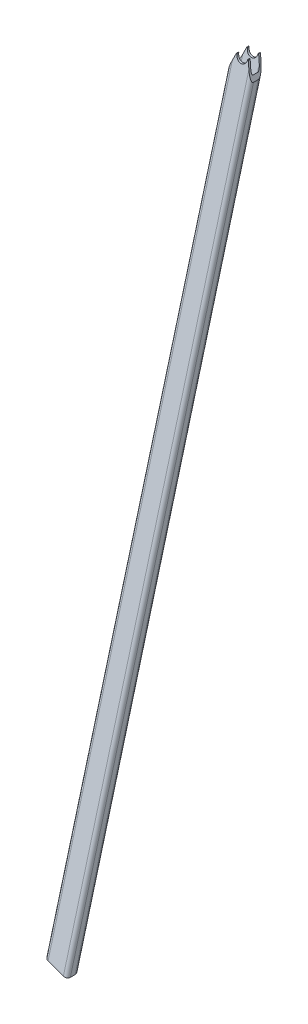
ISO-10303-21;
HEADER;
FILE_DESCRIPTION(('STEP AP214'),'2;1');
FILE_NAME('part.step','',(''),(''),'','','');
FILE_SCHEMA(('AUTOMOTIVE_DESIGN { 1 0 10303 214 1 1 1 1 }'));
ENDSEC;
DATA;
#1=APPLICATION_CONTEXT('core data for automotive mechanical design processes');
#2=APPLICATION_PROTOCOL_DEFINITION('international standard','automotive_design',2000,#1);
#3=PRODUCT_CONTEXT('',#1,'mechanical');
#4=PRODUCT('Part','Part','',(#3));
#5=PRODUCT_RELATED_PRODUCT_CATEGORY('part','',(#4));
#6=PRODUCT_DEFINITION_FORMATION('','',#4);
#7=PRODUCT_DEFINITION_CONTEXT('part definition',#1,'design');
#8=PRODUCT_DEFINITION('design','',#6,#7);
#9=PRODUCT_DEFINITION_SHAPE('','',#8);
#10=(LENGTH_UNIT() NAMED_UNIT(*) SI_UNIT(.MILLI.,.METRE.));
#11=(NAMED_UNIT(*) PLANE_ANGLE_UNIT() SI_UNIT($,.RADIAN.));
#12=(NAMED_UNIT(*) SI_UNIT($,.STERADIAN.) SOLID_ANGLE_UNIT());
#13=UNCERTAINTY_MEASURE_WITH_UNIT(LENGTH_MEASURE(1.E-05),#10,'distance_accuracy_value','');
#14=(GEOMETRIC_REPRESENTATION_CONTEXT(3) GLOBAL_UNCERTAINTY_ASSIGNED_CONTEXT((#13)) GLOBAL_UNIT_ASSIGNED_CONTEXT((#10,
#11,#12)) REPRESENTATION_CONTEXT('',''));
#15=CARTESIAN_POINT('',(0.,0.,0.));
#16=DIRECTION('',(0.,0.,1.));
#17=DIRECTION('',(1.,0.,0.));
#18=AXIS2_PLACEMENT_3D('',#15,#16,#17);
#19=CARTESIAN_POINT('',(0.,0.,0.));
#20=DIRECTION('',(0.,1.,0.));
#21=DIRECTION('',(0.,0.,1.));
#22=AXIS2_PLACEMENT_3D('',#19,#20,#21);
#23=PLANE('',#22);
#24=DIRECTION('',(1.,0.,0.));
#25=VECTOR('',#24,1.);
#26=CARTESIAN_POINT('',(0.,0.,10.3527618041008));
#27=LINE('',#26,#25);
#28=CARTESIAN_POINT('',(9.,0.,10.3527618041008));
#29=VERTEX_POINT('',#28);
#30=CARTESIAN_POINT('',(9.9999999999998,0.,10.3527618041008));
#31=VERTEX_POINT('',#30);
#32=EDGE_CURVE('E252',#29,#31,#27,.T.);
#33=ORIENTED_EDGE('',*,*,#32,.T.);
#34=DIRECTION('',(0.,0.,-1.));
#35=VECTOR('',#34,1.);
#36=CARTESIAN_POINT('',(9.99999999999981,0.,0.));
#37=LINE('',#36,#35);
#38=CARTESIAN_POINT('',(9.9999999999998,0.,7.24693326287058));
#39=VERTEX_POINT('',#38);
#40=EDGE_CURVE('E230',#31,#39,#37,.T.);
#41=ORIENTED_EDGE('',*,*,#40,.T.);
#42=DIRECTION('',(1.,0.,0.));
#43=VECTOR('',#42,1.);
#44=CARTESIAN_POINT('',(0.,0.,7.24693326287058));
#45=LINE('',#44,#43);
#46=CARTESIAN_POINT('',(9.,0.,7.24693326287058));
#47=VERTEX_POINT('',#46);
#48=EDGE_CURVE('E211',#47,#39,#45,.T.);
#49=ORIENTED_EDGE('',*,*,#48,.F.);
#50=DIRECTION('',(0.,0.,1.));
#51=VECTOR('',#50,1.);
#52=CARTESIAN_POINT('',(9.,0.,-10.3527618041008));
#53=LINE('',#52,#51);
#54=EDGE_CURVE('E224',#29,#47,#53,.F.);
#55=ORIENTED_EDGE('',*,*,#54,.F.);
#56=EDGE_LOOP('',(#33,#41,#49,#55));
#57=FACE_BOUND('',#56,.T.);
#58=ADVANCED_FACE('F44',(#57),#23,.T.);
#59=DIRECTION('',(1.,0.,0.));
#60=VECTOR('',#59,1.);
#61=CARTESIAN_POINT('',(0.,0.,-10.3527618041008));
#62=LINE('',#61,#60);
#63=CARTESIAN_POINT('',(-9.9999999999998,0.,-10.3527618041008));
#64=VERTEX_POINT('',#63);
#65=CARTESIAN_POINT('',(-9.,0.,-10.3527618041008));
#66=VERTEX_POINT('',#65);
#67=EDGE_CURVE('E260',#64,#66,#62,.T.);
#68=ORIENTED_EDGE('',*,*,#67,.F.);
#69=DIRECTION('',(0.,0.,1.));
#70=VECTOR('',#69,1.);
#71=CARTESIAN_POINT('',(-9.99999999999981,0.,0.));
#72=LINE('',#71,#70);
#73=CARTESIAN_POINT('',(-9.9999999999998,0.,-7.24693326287058));
#74=VERTEX_POINT('',#73);
#75=EDGE_CURVE('E307',#64,#74,#72,.T.);
#76=ORIENTED_EDGE('',*,*,#75,.T.);
#77=DIRECTION('',(1.,0.,0.));
#78=VECTOR('',#77,1.);
#79=CARTESIAN_POINT('',(0.,0.,-7.24693326287058));
#80=LINE('',#79,#78);
#81=CARTESIAN_POINT('',(-9.,0.,-7.24693326287058));
#82=VERTEX_POINT('',#81);
#83=EDGE_CURVE('E376',#74,#82,#80,.T.);
#84=ORIENTED_EDGE('',*,*,#83,.T.);
#85=DIRECTION('',(0.,0.,1.));
#86=VECTOR('',#85,1.);
#87=CARTESIAN_POINT('',(-9.,0.,-10.3527618041008));
#88=LINE('',#87,#86);
#89=EDGE_CURVE('E236',#66,#82,#88,.T.);
#90=ORIENTED_EDGE('',*,*,#89,.F.);
#91=EDGE_LOOP('',(#68,#76,#84,#90));
#92=FACE_BOUND('',#91,.T.);
#93=ADVANCED_FACE('F374',(#92),#23,.T.);
#94=DIRECTION('',(1.,0.,0.));
#95=VECTOR('',#94,1.);
#96=CARTESIAN_POINT('',(0.,0.,7.24693326287058));
#97=LINE('',#96,#95);
#98=CARTESIAN_POINT('',(-9.9999999999998,0.,7.24693326287058));
#99=VERTEX_POINT('',#98);
#100=CARTESIAN_POINT('',(-9.,0.,7.24693326287058));
#101=VERTEX_POINT('',#100);
#102=EDGE_CURVE('E212',#99,#101,#97,.T.);
#103=ORIENTED_EDGE('',*,*,#102,.F.);
#104=DIRECTION('',(0.,0.,1.));
#105=VECTOR('',#104,1.);
#106=CARTESIAN_POINT('',(-9.99999999999981,0.,0.));
#107=LINE('',#106,#105);
#108=CARTESIAN_POINT('',(-9.9999999999998,0.,10.3527618041008));
#109=VERTEX_POINT('',#108);
#110=EDGE_CURVE('E303',#99,#109,#107,.T.);
#111=ORIENTED_EDGE('',*,*,#110,.T.);
#112=CARTESIAN_POINT('',(-9.,0.,10.3527618041008));
#113=VERTEX_POINT('',#112);
#114=EDGE_CURVE('E258',#109,#113,#27,.T.);
#115=ORIENTED_EDGE('',*,*,#114,.T.);
#116=EDGE_CURVE('E234',#101,#113,#88,.T.);
#117=ORIENTED_EDGE('',*,*,#116,.F.);
#118=EDGE_LOOP('',(#103,#111,#115,#117));
#119=FACE_BOUND('',#118,.T.);
#120=ADVANCED_FACE('F454',(#119),#23,.T.);
#121=CARTESIAN_POINT('',(0.,0.,-10.3527618041008));
#122=DIRECTION('',(0.,0.,1.));
#123=DIRECTION('',(1.,0.,0.));
#124=AXIS2_PLACEMENT_3D('',#121,#122,#123);
#125=CYLINDRICAL_SURFACE('',#124,9.);
#126=CARTESIAN_POINT('',(0.,0.,-7.24693326287058));
#127=DIRECTION('',(0.,-0.258819045102521,-0.965925826289068));
#128=DIRECTION('',(0.,-0.965925826289068,0.258819045102521));
#129=AXIS2_PLACEMENT_3D('',#126,#127,#128);
#130=ELLIPSE('',#129,9.31748562369075,9.);
#131=CARTESIAN_POINT('',(9.,0.,-7.24693326287058));
#132=VERTEX_POINT('',#131);
#133=EDGE_CURVE('E238',#132,#82,#130,.T.);
#134=ORIENTED_EDGE('',*,*,#133,.F.);
#135=CARTESIAN_POINT('',(9.,0.,-10.3527618041008));
#136=VERTEX_POINT('',#135);
#137=EDGE_CURVE('E233',#132,#136,#53,.F.);
#138=ORIENTED_EDGE('',*,*,#137,.T.);
#139=CARTESIAN_POINT('',(0.,0.,-10.3527618041008));
#140=DIRECTION('',(0.,-0.258819045102521,-0.965925826289068));
#141=DIRECTION('',(0.,-0.965925826289068,0.258819045102521));
#142=AXIS2_PLACEMENT_3D('',#139,#140,#141);
#143=ELLIPSE('',#142,9.31748562369075,9.);
#144=EDGE_CURVE('E291',#136,#66,#143,.T.);
#145=ORIENTED_EDGE('',*,*,#144,.T.);
#146=ORIENTED_EDGE('',*,*,#89,.T.);
#147=EDGE_LOOP('',(#134,#138,#145,#146));
#148=FACE_BOUND('',#147,.T.);
#149=ADVANCED_FACE('F372',(#148),#125,.F.);
#150=DIRECTION('',(1.,0.,0.));
#151=VECTOR('',#150,1.);
#152=CARTESIAN_POINT('',(0.,0.,-7.24693326287058));
#153=LINE('',#152,#151);
#154=CARTESIAN_POINT('',(9.9999999999998,0.,-7.24693326287058));
#155=VERTEX_POINT('',#154);
#156=EDGE_CURVE('E363',#132,#155,#153,.T.);
#157=ORIENTED_EDGE('',*,*,#156,.T.);
#158=DIRECTION('',(0.,0.,-1.));
#159=VECTOR('',#158,1.);
#160=CARTESIAN_POINT('',(9.99999999999981,0.,0.));
#161=LINE('',#160,#159);
#162=CARTESIAN_POINT('',(9.9999999999998,0.,-10.3527618041008));
#163=VERTEX_POINT('',#162);
#164=EDGE_CURVE('E331',#155,#163,#161,.T.);
#165=ORIENTED_EDGE('',*,*,#164,.T.);
#166=EDGE_CURVE('E256',#136,#163,#62,.T.);
#167=ORIENTED_EDGE('',*,*,#166,.F.);
#168=ORIENTED_EDGE('',*,*,#137,.F.);
#169=EDGE_LOOP('',(#157,#165,#167,#168));
#170=FACE_BOUND('',#169,.T.);
#171=ADVANCED_FACE('F361',(#170),#23,.T.);
#172=CARTESIAN_POINT('',(-20.,21.9067069768066,4.48287736084025));
#173=DIRECTION('',(-1.,0.,0.));
#174=DIRECTION('',(0.,0.,1.));
#175=AXIS2_PLACEMENT_3D('',#172,#173,#174);
#176=PLANE('',#175);
#177=DIRECTION('',(0.,0.965925826289068,-0.258819045102521));
#178=VECTOR('',#177,1.);
#179=CARTESIAN_POINT('',(-20.,-1.55291427061513,4.55720684636642));
#180=LINE('',#179,#178);
#181=CARTESIAN_POINT('',(-20.,-1174.64101615138,318.885216395876));
#182=VERTEX_POINT('',#181);
#183=CARTESIAN_POINT('',(-20.,-27.474774194547,11.5029482792967));
#184=VERTEX_POINT('',#183);
#185=EDGE_CURVE('E267',#182,#184,#180,.T.);
#186=ORIENTED_EDGE('',*,*,#185,.T.);
#187=DIRECTION('',(0.,0.,-1.));
#188=VECTOR('',#187,1.);
#189=CARTESIAN_POINT('',(-20.,-27.474774194547,4.48287736084025));
#190=LINE('',#189,#188);
#191=CARTESIAN_POINT('',(-20.,-27.474774194547,3.22073883601599));
#192=VERTEX_POINT('',#191);
#193=EDGE_CURVE('E292',#184,#192,#190,.T.);
#194=ORIENTED_EDGE('',*,*,#193,.T.);
#195=DIRECTION('',(0.,0.965925826289068,-0.258819045102521));
#196=VECTOR('',#195,1.);
#197=CARTESIAN_POINT('',(-20.,18.2832403453713,-9.04008420720671));
#198=LINE('',#197,#196);
#199=CARTESIAN_POINT('',(-20.,-1174.64101615138,310.603006952595));
#200=VERTEX_POINT('',#199);
#201=EDGE_CURVE('E275',#192,#200,#198,.F.);
#202=ORIENTED_EDGE('',*,*,#201,.T.);
#203=DIRECTION('',(0.,0.,-1.));
#204=VECTOR('',#203,1.);
#205=CARTESIAN_POINT('',(-20.,-1174.64101615138,4.48287736084025));
#206=LINE('',#205,#204);
#207=EDGE_CURVE('E248',#182,#200,#206,.T.);
#208=ORIENTED_EDGE('',*,*,#207,.F.);
#209=EDGE_LOOP('',(#186,#194,#202,#208));
#210=FACE_BOUND('',#209,.T.);
#211=ADVANCED_FACE('F444',(#210),#176,.T.);
#212=CARTESIAN_POINT('',(20.,21.9067069768066,4.48287736084025));
#213=DIRECTION('',(1.,0.,0.));
#214=DIRECTION('',(0.,0.,-1.));
#215=AXIS2_PLACEMENT_3D('',#212,#213,#214);
#216=PLANE('',#215);
#217=DIRECTION('',(0.,-0.965925826289068,0.258819045102521));
#218=VECTOR('',#217,1.);
#219=CARTESIAN_POINT('',(20.,18.2832403453713,-9.0400842072067));
#220=LINE('',#219,#218);
#221=CARTESIAN_POINT('',(20.,-1185.35898384862,313.474877741575));
#222=VERTEX_POINT('',#221);
#223=CARTESIAN_POINT('',(20.,-27.474774194547,3.22073883601601));
#224=VERTEX_POINT('',#223);
#225=EDGE_CURVE('E281',#222,#224,#220,.F.);
#226=ORIENTED_EDGE('',*,*,#225,.T.);
#227=DIRECTION('',(0.,0.,1.));
#228=VECTOR('',#227,1.);
#229=CARTESIAN_POINT('',(20.,-27.474774194547,4.48287736084025));
#230=LINE('',#229,#228);
#231=CARTESIAN_POINT('',(20.,-27.4747741945469,11.5029482792967));
#232=VERTEX_POINT('',#231);
#233=EDGE_CURVE('E330',#224,#232,#230,.T.);
#234=ORIENTED_EDGE('',*,*,#233,.T.);
#235=DIRECTION('',(0.,-0.965925826289068,0.258819045102521));
#236=VECTOR('',#235,1.);
#237=CARTESIAN_POINT('',(20.,-1186.91189811924,322.173189309582));
#238=LINE('',#237,#236);
#239=CARTESIAN_POINT('',(20.,-1185.35898384862,321.757087184856));
#240=VERTEX_POINT('',#239);
#241=EDGE_CURVE('E285',#232,#240,#238,.T.);
#242=ORIENTED_EDGE('',*,*,#241,.T.);
#243=DIRECTION('',(0.,0.,1.));
#244=VECTOR('',#243,1.);
#245=CARTESIAN_POINT('',(20.,-1185.35898384862,4.48287736084025));
#246=LINE('',#245,#244);
#247=EDGE_CURVE('E246',#222,#240,#246,.T.);
#248=ORIENTED_EDGE('',*,*,#247,.F.);
#249=EDGE_LOOP('',(#226,#234,#242,#248));
#250=FACE_BOUND('',#249,.T.);
#251=ADVANCED_FACE('F422',(#250),#216,.T.);
#252=CARTESIAN_POINT('',(0.,2.58819045102521,9.65925826289068));
#253=DIRECTION('',(0.,-0.258819045102521,-0.965925826289068));
#254=DIRECTION('',(0.,0.965925826289068,-0.258819045102521));
#255=AXIS2_PLACEMENT_3D('',#252,#253,#254);
#256=PLANE('',#255);
#257=ORIENTED_EDGE('',*,*,#114,.F.);
#258=DIRECTION('',(0.331668125174636,0.911250684670171,-0.24416888505968));
#259=VECTOR('',#258,1.);
#260=CARTESIAN_POINT('',(-18.9284544905438,-24.530727103398,16.9257503212046));
#261=LINE('',#260,#259);
#262=CARTESIAN_POINT('',(-14.,-10.989909677819,13.2974992271634));
#263=VERTEX_POINT('',#262);
#264=EDGE_CURVE('E323',#109,#263,#261,.F.);
#265=ORIENTED_EDGE('',*,*,#264,.T.);
#266=DIRECTION('',(0.,0.965925826289068,-0.258819045102521));
#267=VECTOR('',#266,1.);
#268=CARTESIAN_POINT('',(-14.,-1174.64101615138,325.096873478336));
#269=LINE('',#268,#267);
#270=CARTESIAN_POINT('',(-14.,-1176.24871130596,325.527654096683));
#271=VERTEX_POINT('',#270);
#272=EDGE_CURVE('E286',#263,#271,#269,.F.);
#273=ORIENTED_EDGE('',*,*,#272,.T.);
#274=DIRECTION('',(0.96361137499428,-0.258198889747162,0.0691841839943646));
#275=VECTOR('',#274,1.);
#276=CARTESIAN_POINT('',(-315.356850786941,-1095.50038650402,303.891205675836));
#277=LINE('',#276,#275);
#278=CARTESIAN_POINT('',(14.,-1183.75128869404,327.537963648969));
#279=VERTEX_POINT('',#278);
#280=EDGE_CURVE('E251',#271,#279,#277,.T.);
#281=ORIENTED_EDGE('',*,*,#280,.T.);
#282=DIRECTION('',(0.,-0.965925826289068,0.258819045102521));
#283=VECTOR('',#282,1.);
#284=CARTESIAN_POINT('',(14.,0.,10.3527618041008));
#285=LINE('',#284,#283);
#286=CARTESIAN_POINT('',(14.,-10.9899096778191,13.2974992271635));
#287=VERTEX_POINT('',#286);
#288=EDGE_CURVE('E288',#279,#287,#285,.F.);
#289=ORIENTED_EDGE('',*,*,#288,.T.);
#290=DIRECTION('',(0.331668125174636,-0.911250684670171,0.24416888505968));
#291=VECTOR('',#290,1.);
#292=CARTESIAN_POINT('',(18.9284544905438,-24.530727103398,16.9257503212046));
#293=LINE('',#292,#291);
#294=EDGE_CURVE('E325',#287,#31,#293,.F.);
#295=ORIENTED_EDGE('',*,*,#294,.T.);
#296=ORIENTED_EDGE('',*,*,#32,.F.);
#297=CARTESIAN_POINT('',(0.,0.,10.3527618041008));
#298=DIRECTION('',(0.,-0.258819045102521,-0.965925826289068));
#299=DIRECTION('',(0.,-0.965925826289068,0.258819045102521));
#300=AXIS2_PLACEMENT_3D('',#297,#298,#299);
#301=ELLIPSE('',#300,9.31748562369075,9.);
#302=EDGE_CURVE('E231',#29,#113,#301,.T.);
#303=ORIENTED_EDGE('',*,*,#302,.T.);
#304=EDGE_LOOP('',(#257,#265,#273,#281,#289,#295,#296,#303));
#305=FACE_BOUND('',#304,.T.);
#306=ADVANCED_FACE('F412',(#305),#256,.F.);
#307=CARTESIAN_POINT('',(0.,-2.58819045102521,-9.65925826289068));
#308=DIRECTION('',(0.,-0.258819045102521,-0.965925826289068));
#309=DIRECTION('',(0.,0.965925826289068,-0.258819045102521));
#310=AXIS2_PLACEMENT_3D('',#307,#308,#309);
#311=PLANE('',#310);
#312=DIRECTION('',(0.,0.965925826289068,-0.258819045102521));
#313=VECTOR('',#312,1.);
#314=CARTESIAN_POINT('',(-14.,-2.58819045102521,-9.65925826289068));
#315=LINE('',#314,#313);
#316=CARTESIAN_POINT('',(-14.0000000000001,-1176.24871130596,304.822130488482));
#317=VERTEX_POINT('',#316);
#318=CARTESIAN_POINT('',(-14.,-10.9899096778191,-7.40802438103821));
#319=VERTEX_POINT('',#318);
#320=EDGE_CURVE('E266',#317,#319,#315,.T.);
#321=ORIENTED_EDGE('',*,*,#320,.T.);
#322=DIRECTION('',(-0.331668125174636,-0.911250684670171,0.24416888505968));
#323=VECTOR('',#322,1.);
#324=CARTESIAN_POINT('',(-9.73836063276715,0.718848253512128,-10.5453766131099));
#325=LINE('',#324,#323);
#326=EDGE_CURVE('E301',#319,#64,#325,.F.);
#327=ORIENTED_EDGE('',*,*,#326,.T.);
#328=ORIENTED_EDGE('',*,*,#67,.T.);
#329=ORIENTED_EDGE('',*,*,#144,.F.);
#330=ORIENTED_EDGE('',*,*,#166,.T.);
#331=DIRECTION('',(-0.331668125174636,0.911250684670171,-0.24416888505968));
#332=VECTOR('',#331,1.);
#333=CARTESIAN_POINT('',(9.73836063276715,0.718848253512128,-10.5453766131099));
#334=LINE('',#333,#332);
#335=CARTESIAN_POINT('',(14.,-10.9899096778191,-7.40802438103821));
#336=VERTEX_POINT('',#335);
#337=EDGE_CURVE('E299',#163,#336,#334,.F.);
#338=ORIENTED_EDGE('',*,*,#337,.T.);
#339=DIRECTION('',(0.,-0.965925826289068,0.258819045102521));
#340=VECTOR('',#339,1.);
#341=CARTESIAN_POINT('',(14.,-2.58819045102521,-9.65925826289068));
#342=LINE('',#341,#340);
#343=CARTESIAN_POINT('',(14.,-1183.75128869404,306.832440040768));
#344=VERTEX_POINT('',#343);
#345=EDGE_CURVE('E264',#336,#344,#342,.T.);
#346=ORIENTED_EDGE('',*,*,#345,.T.);
#347=DIRECTION('',(0.96361137499428,-0.258198889747162,0.0691841839943646));
#348=VECTOR('',#347,1.);
#349=CARTESIAN_POINT('',(-313.976482546394,-1095.87025505933,283.284788048336));
#350=LINE('',#349,#348);
#351=EDGE_CURVE('E263',#317,#344,#350,.T.);
#352=ORIENTED_EDGE('',*,*,#351,.F.);
#353=EDGE_LOOP('',(#321,#327,#328,#329,#330,#338,#346,#352));
#354=FACE_BOUND('',#353,.T.);
#355=ADVANCED_FACE('F366',(#354),#311,.T.);
#356=CARTESIAN_POINT('',(-295.000000000001,-1100.95498823282,0.));
#357=DIRECTION('',(0.258819045102521,0.965925826289068,0.));
#358=DIRECTION('',(-0.965925826289068,0.258819045102521,0.));
#359=AXIS2_PLACEMENT_3D('',#356,#357,#358);
#360=PLANE('',#359);
#361=DIRECTION('',(0.,0.,-1.));
#362=VECTOR('',#361,1.);
#363=CARTESIAN_POINT('',(-17.,-1175.44486372867,4.48287736084025));
#364=LINE('',#363,#362);
#365=CARTESIAN_POINT('',(-17.,-1175.44486372867,319.10060670505));
#366=VERTEX_POINT('',#365);
#367=CARTESIAN_POINT('',(-17.,-1175.44486372867,310.818397261769));
#368=VERTEX_POINT('',#367);
#369=EDGE_CURVE('E386',#366,#368,#364,.T.);
#370=ORIENTED_EDGE('',*,*,#369,.F.);
#371=CARTESIAN_POINT('',(-14.,-1176.24871130596,319.315997014223));
#372=DIRECTION('',(0.258819045102521,0.965925826289068,0.));
#373=DIRECTION('',(0.67107367459345,-0.179813649169101,0.719254596676404));
#374=AXIS2_PLACEMENT_3D('',#371,#372,#373);
#375=ELLIPSE('',#374,3.21539030917347,3.);
#376=CARTESIAN_POINT('',(-14.,-1176.24871130596,322.421825555453));
#377=VERTEX_POINT('',#376);
#378=EDGE_CURVE('E244',#377,#366,#375,.F.);
#379=ORIENTED_EDGE('',*,*,#378,.F.);
#380=DIRECTION('',(0.96361137499428,-0.258198889747162,0.0691841839943646));
#381=VECTOR('',#380,1.);
#382=CARTESIAN_POINT('',(-315.149795550859,-1095.55586678731,300.800243031711));
#383=LINE('',#382,#381);
#384=CARTESIAN_POINT('',(14.,-1183.75128869404,324.432135107739));
#385=VERTEX_POINT('',#384);
#386=EDGE_CURVE('E228',#377,#385,#383,.T.);
#387=ORIENTED_EDGE('',*,*,#386,.T.);
#388=CARTESIAN_POINT('',(14.,-1183.75128869404,321.326306566509));
#389=DIRECTION('',(0.258819045102521,0.965925826289068,0.));
#390=DIRECTION('',(-0.67107367459345,0.179813649169101,-0.719254596676404));
#391=AXIS2_PLACEMENT_3D('',#388,#389,#390);
#392=ELLIPSE('',#391,3.21539030917347,3.);
#393=CARTESIAN_POINT('',(17.,-1184.55513627133,321.541696875682));
#394=VERTEX_POINT('',#393);
#395=EDGE_CURVE('E396',#394,#385,#392,.F.);
#396=ORIENTED_EDGE('',*,*,#395,.F.);
#397=DIRECTION('',(0.,0.,1.));
#398=VECTOR('',#397,1.);
#399=CARTESIAN_POINT('',(17.,-1184.55513627133,4.48287736084025));
#400=LINE('',#399,#398);
#401=CARTESIAN_POINT('',(17.,-1184.55513627133,313.259487432402));
#402=VERTEX_POINT('',#401);
#403=EDGE_CURVE('E217',#402,#394,#400,.T.);
#404=ORIENTED_EDGE('',*,*,#403,.F.);
#405=CARTESIAN_POINT('',(14.,-1183.75128869404,313.044097123228));
#406=DIRECTION('',(0.258819045102521,0.965925826289068,0.));
#407=DIRECTION('',(0.67107367459345,-0.179813649169101,0.719254596676404));
#408=AXIS2_PLACEMENT_3D('',#405,#406,#407);
#409=ELLIPSE('',#408,3.21539030917347,3.);
#410=CARTESIAN_POINT('',(14.,-1183.75128869404,309.938268581998));
#411=VERTEX_POINT('',#410);
#412=EDGE_CURVE('E395',#411,#402,#409,.F.);
#413=ORIENTED_EDGE('',*,*,#412,.F.);
#414=DIRECTION('',(0.96361137499428,-0.258198889747162,0.0691841839943646));
#415=VECTOR('',#414,1.);
#416=CARTESIAN_POINT('',(-314.183537782476,-1095.81477477603,286.375750692461));
#417=LINE('',#416,#415);
#418=CARTESIAN_POINT('',(-14.0000000000001,-1176.24871130596,307.927959029712));
#419=VERTEX_POINT('',#418);
#420=EDGE_CURVE('E355',#419,#411,#417,.T.);
#421=ORIENTED_EDGE('',*,*,#420,.F.);
#422=CARTESIAN_POINT('',(-14.,-1176.24871130596,311.033787570942));
#423=DIRECTION('',(0.258819045102521,0.965925826289068,0.));
#424=DIRECTION('',(-0.67107367459345,0.179813649169101,-0.719254596676404));
#425=AXIS2_PLACEMENT_3D('',#422,#423,#424);
#426=ELLIPSE('',#425,3.21539030917347,3.);
#427=EDGE_CURVE('E387',#368,#419,#426,.F.);
#428=ORIENTED_EDGE('',*,*,#427,.F.);
#429=EDGE_LOOP('',(#370,#379,#387,#396,#404,#413,#421,#428));
#430=FACE_BOUND('',#429,.T.);
#431=ORIENTED_EDGE('',*,*,#207,.T.);
#432=CARTESIAN_POINT('',(-14.,-1176.24871130596,311.033787570942));
#433=DIRECTION('',(0.258819045102521,0.965925826289068,0.));
#434=DIRECTION('',(-0.67107367459345,0.179813649169101,-0.719254596676404));
#435=AXIS2_PLACEMENT_3D('',#432,#433,#434);
#436=ELLIPSE('',#435,6.43078061834695,6.);
#437=EDGE_CURVE('E279',#200,#317,#436,.F.);
#438=ORIENTED_EDGE('',*,*,#437,.T.);
#439=ORIENTED_EDGE('',*,*,#351,.T.);
#440=CARTESIAN_POINT('',(14.,-1183.75128869404,313.044097123228));
#441=DIRECTION('',(0.258819045102521,0.965925826289068,0.));
#442=DIRECTION('',(0.67107367459345,-0.179813649169101,0.719254596676404));
#443=AXIS2_PLACEMENT_3D('',#440,#441,#442);
#444=ELLIPSE('',#443,6.43078061834695,6.);
#445=EDGE_CURVE('E277',#344,#222,#444,.F.);
#446=ORIENTED_EDGE('',*,*,#445,.T.);
#447=ORIENTED_EDGE('',*,*,#247,.T.);
#448=CARTESIAN_POINT('',(14.,-1183.75128869404,321.326306566509));
#449=DIRECTION('',(0.258819045102521,0.965925826289068,0.));
#450=DIRECTION('',(-0.67107367459345,0.179813649169101,-0.719254596676404));
#451=AXIS2_PLACEMENT_3D('',#448,#449,#450);
#452=ELLIPSE('',#451,6.43078061834695,6.);
#453=EDGE_CURVE('E276',#240,#279,#452,.F.);
#454=ORIENTED_EDGE('',*,*,#453,.T.);
#455=ORIENTED_EDGE('',*,*,#280,.F.);
#456=CARTESIAN_POINT('',(-14.,-1176.24871130596,319.315997014223));
#457=DIRECTION('',(0.258819045102521,0.965925826289068,0.));
#458=DIRECTION('',(0.67107367459345,-0.179813649169101,0.719254596676404));
#459=AXIS2_PLACEMENT_3D('',#456,#457,#458);
#460=ELLIPSE('',#459,6.43078061834695,6.);
#461=EDGE_CURVE('E272',#271,#182,#460,.F.);
#462=ORIENTED_EDGE('',*,*,#461,.T.);
#463=EDGE_LOOP('',(#431,#438,#439,#446,#447,#454,#455,#462));
#464=FACE_BOUND('',#463,.T.);
#465=ADVANCED_FACE('F402',(#430,#464),#360,.F.);
#466=CARTESIAN_POINT('',(-14.,-1.03527618041009,-3.86370330515627));
#467=DIRECTION('',(0.,0.965925826289068,-0.258819045102521));
#468=DIRECTION('',(0.,0.258819045102521,0.965925826289068));
#469=AXIS2_PLACEMENT_3D('',#466,#467,#468);
#470=CYLINDRICAL_SURFACE('',#469,6.);
#471=ORIENTED_EDGE('',*,*,#201,.F.);
#472=CARTESIAN_POINT('',(-14.,-10.9899096778191,-1.19636729857771));
#473=DIRECTION('',(0.939692620785909,-0.342020143325666,0.));
#474=DIRECTION('',(0.328909923583208,0.903672588079418,-0.27421545492976));
#475=AXIS2_PLACEMENT_3D('',#472,#473,#474);
#476=ELLIPSE('',#475,18.1616703100024,6.);
#477=EDGE_CURVE('E297',#192,#319,#476,.T.);
#478=ORIENTED_EDGE('',*,*,#477,.T.);
#479=ORIENTED_EDGE('',*,*,#320,.F.);
#480=ORIENTED_EDGE('',*,*,#437,.F.);
#481=EDGE_LOOP('',(#471,#478,#479,#480));
#482=FACE_BOUND('',#481,.T.);
#483=ADVANCED_FACE('F433',(#482),#470,.T.);
#484=CARTESIAN_POINT('',(14.,-1.03527618041009,-3.86370330515627));
#485=DIRECTION('',(0.,-0.965925826289068,0.258819045102521));
#486=DIRECTION('',(0.,-0.258819045102521,-0.965925826289068));
#487=AXIS2_PLACEMENT_3D('',#484,#485,#486);
#488=CYLINDRICAL_SURFACE('',#487,6.);
#489=ORIENTED_EDGE('',*,*,#345,.F.);
#490=CARTESIAN_POINT('',(14.,-10.9899096778191,-1.19636729857771));
#491=DIRECTION('',(-0.939692620785909,-0.342020143325666,0.));
#492=DIRECTION('',(0.328909923583208,-0.903672588079418,0.27421545492976));
#493=AXIS2_PLACEMENT_3D('',#490,#491,#492);
#494=ELLIPSE('',#493,18.1616703100024,6.);
#495=EDGE_CURVE('E12',#336,#224,#494,.T.);
#496=ORIENTED_EDGE('',*,*,#495,.T.);
#497=ORIENTED_EDGE('',*,*,#225,.F.);
#498=ORIENTED_EDGE('',*,*,#445,.F.);
#499=EDGE_LOOP('',(#489,#496,#497,#498));
#500=FACE_BOUND('',#499,.T.);
#501=ADVANCED_FACE('F430',(#500),#488,.T.);
#502=CARTESIAN_POINT('',(14.,20.3537927061915,-1.31267759689415));
#503=DIRECTION('',(0.,0.965925826289068,-0.258819045102521));
#504=DIRECTION('',(0.,0.258819045102521,0.965925826289068));
#505=AXIS2_PLACEMENT_3D('',#502,#503,#504);
#506=CYLINDRICAL_SURFACE('',#505,6.);
#507=ORIENTED_EDGE('',*,*,#241,.F.);
#508=CARTESIAN_POINT('',(14.,-10.9899096778191,7.08584214470295));
#509=DIRECTION('',(-0.939692620785909,-0.342020143325666,0.));
#510=DIRECTION('',(-0.328909923583208,0.903672588079418,-0.27421545492976));
#511=AXIS2_PLACEMENT_3D('',#508,#509,#510);
#512=ELLIPSE('',#511,18.1616703100024,6.);
#513=EDGE_CURVE('E333',#232,#287,#512,.T.);
#514=ORIENTED_EDGE('',*,*,#513,.T.);
#515=ORIENTED_EDGE('',*,*,#288,.F.);
#516=ORIENTED_EDGE('',*,*,#453,.F.);
#517=EDGE_LOOP('',(#507,#514,#515,#516));
#518=FACE_BOUND('',#517,.T.);
#519=ADVANCED_FACE('F421',(#518),#506,.T.);
#520=CARTESIAN_POINT('',(-14.,20.3537927061915,-1.31267759689415));
#521=DIRECTION('',(0.,-0.965925826289068,0.258819045102521));
#522=DIRECTION('',(0.,-0.258819045102521,-0.965925826289068));
#523=AXIS2_PLACEMENT_3D('',#520,#521,#522);
#524=CYLINDRICAL_SURFACE('',#523,6.);
#525=ORIENTED_EDGE('',*,*,#272,.F.);
#526=CARTESIAN_POINT('',(-14.,-10.9899096778191,7.08584214470295));
#527=DIRECTION('',(0.939692620785909,-0.342020143325666,0.));
#528=DIRECTION('',(-0.328909923583208,-0.903672588079418,0.27421545492976));
#529=AXIS2_PLACEMENT_3D('',#526,#527,#528);
#530=ELLIPSE('',#529,18.1616703100024,6.);
#531=EDGE_CURVE('E329',#263,#184,#530,.T.);
#532=ORIENTED_EDGE('',*,*,#531,.T.);
#533=ORIENTED_EDGE('',*,*,#185,.F.);
#534=ORIENTED_EDGE('',*,*,#461,.F.);
#535=EDGE_LOOP('',(#525,#532,#533,#534));
#536=FACE_BOUND('',#535,.T.);
#537=ADVANCED_FACE('F450',(#536),#524,.T.);
#538=ORIENTED_EDGE('',*,*,#54,.T.);
#539=CARTESIAN_POINT('',(0.,0.,7.24693326287058));
#540=DIRECTION('',(0.,-0.258819045102521,-0.965925826289068));
#541=DIRECTION('',(0.,-0.965925826289068,0.258819045102521));
#542=AXIS2_PLACEMENT_3D('',#539,#540,#541);
#543=ELLIPSE('',#542,9.31748562369075,9.);
#544=EDGE_CURVE('E209',#47,#101,#543,.T.);
#545=ORIENTED_EDGE('',*,*,#544,.T.);
#546=ORIENTED_EDGE('',*,*,#116,.T.);
#547=ORIENTED_EDGE('',*,*,#302,.F.);
#548=EDGE_LOOP('',(#538,#545,#546,#547));
#549=FACE_BOUND('',#548,.T.);
#550=ADVANCED_FACE('F232',(#549),#125,.F.);
#551=CARTESIAN_POINT('',(-17.,21.9067069768066,4.48287736084025));
#552=DIRECTION('',(-1.,0.,0.));
#553=DIRECTION('',(0.,0.,1.));
#554=AXIS2_PLACEMENT_3D('',#551,#552,#553);
#555=PLANE('',#554);
#556=DIRECTION('',(0.,0.965925826289068,-0.258819045102521));
#557=VECTOR('',#556,1.);
#558=CARTESIAN_POINT('',(-17.,-1.03527618041008,-3.86370330515626));
#559=LINE('',#558,#557);
#560=CARTESIAN_POINT('',(-17.,-19.2323419361831,1.01218576871916));
#561=VERTEX_POINT('',#560);
#562=EDGE_CURVE('E461',#561,#368,#559,.F.);
#563=ORIENTED_EDGE('',*,*,#562,.F.);
#564=DIRECTION('',(0.,0.,-1.));
#565=VECTOR('',#564,1.);
#566=CARTESIAN_POINT('',(-17.,-19.2323419361831,4.48287736084025));
#567=LINE('',#566,#565);
#568=CARTESIAN_POINT('',(-17.,-19.2323419361831,9.29439521199984));
#569=VERTEX_POINT('',#568);
#570=EDGE_CURVE('E313',#561,#569,#567,.F.);
#571=ORIENTED_EDGE('',*,*,#570,.T.);
#572=DIRECTION('',(0.,-0.965925826289068,0.258819045102521));
#573=VECTOR('',#572,1.);
#574=CARTESIAN_POINT('',(-17.,20.3537927061915,-1.31267759689413));
#575=LINE('',#574,#573);
#576=EDGE_CURVE('E459',#366,#569,#575,.F.);
#577=ORIENTED_EDGE('',*,*,#576,.F.);
#578=ORIENTED_EDGE('',*,*,#369,.T.);
#579=EDGE_LOOP('',(#563,#571,#577,#578));
#580=FACE_BOUND('',#579,.T.);
#581=ADVANCED_FACE('F467',(#580),#555,.F.);
#582=CARTESIAN_POINT('',(17.,21.9067069768066,4.48287736084025));
#583=DIRECTION('',(1.,0.,0.));
#584=DIRECTION('',(0.,0.,-1.));
#585=AXIS2_PLACEMENT_3D('',#582,#583,#584);
#586=PLANE('',#585);
#587=DIRECTION('',(0.,0.965925826289068,-0.258819045102521));
#588=VECTOR('',#587,1.);
#589=CARTESIAN_POINT('',(17.,20.3537927061915,-1.31267759689414));
#590=LINE('',#589,#588);
#591=CARTESIAN_POINT('',(17.,-19.2323419361831,9.29439521199983));
#592=VERTEX_POINT('',#591);
#593=EDGE_CURVE('E391',#592,#394,#590,.F.);
#594=ORIENTED_EDGE('',*,*,#593,.F.);
#595=DIRECTION('',(0.,0.,1.));
#596=VECTOR('',#595,1.);
#597=CARTESIAN_POINT('',(17.,-19.2323419361831,4.48287736084025));
#598=LINE('',#597,#596);
#599=CARTESIAN_POINT('',(17.,-19.2323419361831,1.01218576871916));
#600=VERTEX_POINT('',#599);
#601=EDGE_CURVE('E64',#592,#600,#598,.F.);
#602=ORIENTED_EDGE('',*,*,#601,.T.);
#603=DIRECTION('',(0.,-0.965925826289068,0.258819045102521));
#604=VECTOR('',#603,1.);
#605=CARTESIAN_POINT('',(17.,-1.03527618041008,-3.86370330515626));
#606=LINE('',#605,#604);
#607=EDGE_CURVE('E343',#402,#600,#606,.F.);
#608=ORIENTED_EDGE('',*,*,#607,.F.);
#609=ORIENTED_EDGE('',*,*,#403,.T.);
#610=EDGE_LOOP('',(#594,#602,#608,#609));
#611=FACE_BOUND('',#610,.T.);
#612=ADVANCED_FACE('F570',(#611),#586,.F.);
#613=CARTESIAN_POINT('',(0.,1.81173331571765,6.76148078402348));
#614=DIRECTION('',(0.,-0.258819045102521,-0.965925826289068));
#615=DIRECTION('',(0.,0.965925826289068,-0.258819045102521));
#616=AXIS2_PLACEMENT_3D('',#613,#614,#615);
#617=PLANE('',#616);
#618=DIRECTION('',(0.,0.965925826289068,-0.258819045102521));
#619=VECTOR('',#618,1.);
#620=CARTESIAN_POINT('',(-14.,1.81173331571765,6.76148078402348));
#621=LINE('',#620,#619);
#622=CARTESIAN_POINT('',(-14.,-10.9899096778191,10.1916706859332));
#623=VERTEX_POINT('',#622);
#624=EDGE_CURVE('E381',#623,#377,#621,.F.);
#625=ORIENTED_EDGE('',*,*,#624,.F.);
#626=DIRECTION('',(-0.331668125174636,-0.911250684670171,0.24416888505968));
#627=VECTOR('',#626,1.);
#628=CARTESIAN_POINT('',(-8.31308388769612,4.63476392706861,6.00505201150365));
#629=LINE('',#628,#627);
#630=EDGE_CURVE('E317',#623,#99,#629,.F.);
#631=ORIENTED_EDGE('',*,*,#630,.T.);
#632=ORIENTED_EDGE('',*,*,#102,.T.);
#633=ORIENTED_EDGE('',*,*,#544,.F.);
#634=ORIENTED_EDGE('',*,*,#48,.T.);
#635=DIRECTION('',(-0.331668125174636,0.911250684670171,-0.24416888505968));
#636=VECTOR('',#635,1.);
#637=CARTESIAN_POINT('',(8.31308388769612,4.63476392706861,6.00505201150365));
#638=LINE('',#637,#636);
#639=CARTESIAN_POINT('',(14.,-10.9899096778192,10.1916706859332));
#640=VERTEX_POINT('',#639);
#641=EDGE_CURVE('E320',#39,#640,#638,.F.);
#642=ORIENTED_EDGE('',*,*,#641,.T.);
#643=DIRECTION('',(0.,0.965925826289068,-0.258819045102521));
#644=VECTOR('',#643,1.);
#645=CARTESIAN_POINT('',(14.,1.81173331571765,6.76148078402348));
#646=LINE('',#645,#644);
#647=EDGE_CURVE('E382',#385,#640,#646,.T.);
#648=ORIENTED_EDGE('',*,*,#647,.F.);
#649=ORIENTED_EDGE('',*,*,#386,.F.);
#650=EDGE_LOOP('',(#625,#631,#632,#633,#634,#642,#648,#649));
#651=FACE_BOUND('',#650,.T.);
#652=ADVANCED_FACE('F214',(#651),#617,.T.);
#653=CARTESIAN_POINT('',(0.,-1.81173331571765,-6.76148078402348));
#654=DIRECTION('',(0.,-0.258819045102521,-0.965925826289068));
#655=DIRECTION('',(0.,0.965925826289068,-0.258819045102521));
#656=AXIS2_PLACEMENT_3D('',#653,#654,#655);
#657=PLANE('',#656);
#658=ORIENTED_EDGE('',*,*,#83,.F.);
#659=DIRECTION('',(0.331668125174636,0.911250684670171,-0.24416888505968));
#660=VECTOR('',#659,1.);
#661=CARTESIAN_POINT('',(-20.3537312356148,-28.4466427769545,0.375321696591021));
#662=LINE('',#661,#660);
#663=CARTESIAN_POINT('',(-14.0000000000001,-10.9899096778193,-4.30219583980791));
#664=VERTEX_POINT('',#663);
#665=EDGE_CURVE('E308',#74,#664,#662,.F.);
#666=ORIENTED_EDGE('',*,*,#665,.T.);
#667=DIRECTION('',(0.,0.965925826289068,-0.258819045102521));
#668=VECTOR('',#667,1.);
#669=CARTESIAN_POINT('',(-14.0000000000001,-1.81173331571765,-6.76148078402348));
#670=LINE('',#669,#668);
#671=EDGE_CURVE('E353',#419,#664,#670,.T.);
#672=ORIENTED_EDGE('',*,*,#671,.F.);
#673=ORIENTED_EDGE('',*,*,#420,.T.);
#674=DIRECTION('',(0.,0.965925826289068,-0.258819045102521));
#675=VECTOR('',#674,1.);
#676=CARTESIAN_POINT('',(14.,-1.81173331571765,-6.76148078402348));
#677=LINE('',#676,#675);
#678=CARTESIAN_POINT('',(14.,-10.9899096778191,-4.30219583980797));
#679=VERTEX_POINT('',#678);
#680=EDGE_CURVE('E341',#679,#411,#677,.F.);
#681=ORIENTED_EDGE('',*,*,#680,.F.);
#682=DIRECTION('',(0.331668125174636,-0.911250684670171,0.24416888505968));
#683=VECTOR('',#682,1.);
#684=CARTESIAN_POINT('',(20.3537312356148,-28.4466427769545,0.375321696591021));
#685=LINE('',#684,#683);
#686=EDGE_CURVE('E306',#679,#155,#685,.F.);
#687=ORIENTED_EDGE('',*,*,#686,.T.);
#688=ORIENTED_EDGE('',*,*,#156,.F.);
#689=ORIENTED_EDGE('',*,*,#133,.T.);
#690=EDGE_LOOP('',(#658,#666,#672,#673,#681,#687,#688,#689));
#691=FACE_BOUND('',#690,.T.);
#692=ADVANCED_FACE('F348',(#691),#657,.F.);
#693=CARTESIAN_POINT('',(-14.,-1.03527618041009,-3.86370330515627));
#694=DIRECTION('',(0.,0.965925826289068,-0.258819045102521));
#695=DIRECTION('',(0.,0.258819045102521,0.965925826289068));
#696=AXIS2_PLACEMENT_3D('',#693,#694,#695);
#697=CYLINDRICAL_SURFACE('',#696,3.);
#698=ORIENTED_EDGE('',*,*,#671,.T.);
#699=CARTESIAN_POINT('',(-14.,-10.9899096778191,-1.19636729857771));
#700=DIRECTION('',(0.939692620785909,-0.342020143325666,0.));
#701=DIRECTION('',(0.328909923583208,0.903672588079418,-0.27421545492976));
#702=AXIS2_PLACEMENT_3D('',#699,#700,#701);
#703=ELLIPSE('',#702,9.08083515500118,3.);
#704=EDGE_CURVE('E311',#664,#561,#703,.F.);
#705=ORIENTED_EDGE('',*,*,#704,.T.);
#706=ORIENTED_EDGE('',*,*,#562,.T.);
#707=ORIENTED_EDGE('',*,*,#427,.T.);
#708=EDGE_LOOP('',(#698,#705,#706,#707));
#709=FACE_BOUND('',#708,.T.);
#710=ADVANCED_FACE('F472',(#709),#697,.F.);
#711=CARTESIAN_POINT('',(14.,-1.03527618041009,-3.86370330515627));
#712=DIRECTION('',(0.,-0.965925826289068,0.258819045102521));
#713=DIRECTION('',(0.,-0.258819045102521,-0.965925826289068));
#714=AXIS2_PLACEMENT_3D('',#711,#712,#713);
#715=CYLINDRICAL_SURFACE('',#714,3.);
#716=ORIENTED_EDGE('',*,*,#607,.T.);
#717=CARTESIAN_POINT('',(14.,-10.9899096778191,-1.19636729857771));
#718=DIRECTION('',(-0.939692620785909,-0.342020143325666,0.));
#719=DIRECTION('',(0.328909923583208,-0.903672588079418,0.27421545492976));
#720=AXIS2_PLACEMENT_3D('',#717,#718,#719);
#721=ELLIPSE('',#720,9.08083515500118,3.);
#722=EDGE_CURVE('E53',#600,#679,#721,.F.);
#723=ORIENTED_EDGE('',*,*,#722,.T.);
#724=ORIENTED_EDGE('',*,*,#680,.T.);
#725=ORIENTED_EDGE('',*,*,#412,.T.);
#726=EDGE_LOOP('',(#716,#723,#724,#725));
#727=FACE_BOUND('',#726,.T.);
#728=ADVANCED_FACE('F337',(#727),#715,.F.);
#729=CARTESIAN_POINT('',(14.,20.3537927061915,-1.31267759689415));
#730=DIRECTION('',(0.,0.965925826289068,-0.258819045102521));
#731=DIRECTION('',(0.,0.258819045102521,0.965925826289068));
#732=AXIS2_PLACEMENT_3D('',#729,#730,#731);
#733=CYLINDRICAL_SURFACE('',#732,3.);
#734=ORIENTED_EDGE('',*,*,#647,.T.);
#735=CARTESIAN_POINT('',(14.,-10.9899096778191,7.08584214470295));
#736=DIRECTION('',(-0.939692620785909,-0.342020143325666,0.));
#737=DIRECTION('',(-0.328909923583208,0.903672588079418,-0.27421545492976));
#738=AXIS2_PLACEMENT_3D('',#735,#736,#737);
#739=ELLIPSE('',#738,9.08083515500118,3.);
#740=EDGE_CURVE('E68',#640,#592,#739,.F.);
#741=ORIENTED_EDGE('',*,*,#740,.T.);
#742=ORIENTED_EDGE('',*,*,#593,.T.);
#743=ORIENTED_EDGE('',*,*,#395,.T.);
#744=EDGE_LOOP('',(#734,#741,#742,#743));
#745=FACE_BOUND('',#744,.T.);
#746=ADVANCED_FACE('F409',(#745),#733,.F.);
#747=CARTESIAN_POINT('',(-14.,20.3537927061915,-1.31267759689415));
#748=DIRECTION('',(0.,-0.965925826289068,0.258819045102521));
#749=DIRECTION('',(0.,-0.258819045102521,-0.965925826289068));
#750=AXIS2_PLACEMENT_3D('',#747,#748,#749);
#751=CYLINDRICAL_SURFACE('',#750,3.);
#752=ORIENTED_EDGE('',*,*,#576,.T.);
#753=CARTESIAN_POINT('',(-14.,-10.9899096778191,7.08584214470295));
#754=DIRECTION('',(0.939692620785909,-0.342020143325666,0.));
#755=DIRECTION('',(-0.328909923583208,-0.903672588079418,0.27421545492976));
#756=AXIS2_PLACEMENT_3D('',#753,#754,#755);
#757=ELLIPSE('',#756,9.08083515500118,3.);
#758=EDGE_CURVE('E319',#569,#623,#757,.F.);
#759=ORIENTED_EDGE('',*,*,#758,.T.);
#760=ORIENTED_EDGE('',*,*,#624,.T.);
#761=ORIENTED_EDGE('',*,*,#378,.T.);
#762=EDGE_LOOP('',(#752,#759,#760,#761));
#763=FACE_BOUND('',#762,.T.);
#764=ADVANCED_FACE('F466',(#763),#751,.F.);
#765=CARTESIAN_POINT('',(-20.,-27.474774194547,4.48287736084025));
#766=DIRECTION('',(0.939692620785909,-0.342020143325666,0.));
#767=DIRECTION('',(0.,0.,-1.));
#768=AXIS2_PLACEMENT_3D('',#765,#766,#767);
#769=PLANE('',#768);
#770=ORIENTED_EDGE('',*,*,#665,.F.);
#771=ORIENTED_EDGE('',*,*,#75,.F.);
#772=ORIENTED_EDGE('',*,*,#326,.F.);
#773=ORIENTED_EDGE('',*,*,#477,.F.);
#774=ORIENTED_EDGE('',*,*,#193,.F.);
#775=ORIENTED_EDGE('',*,*,#531,.F.);
#776=ORIENTED_EDGE('',*,*,#264,.F.);
#777=ORIENTED_EDGE('',*,*,#110,.F.);
#778=ORIENTED_EDGE('',*,*,#630,.F.);
#779=ORIENTED_EDGE('',*,*,#758,.F.);
#780=ORIENTED_EDGE('',*,*,#570,.F.);
#781=ORIENTED_EDGE('',*,*,#704,.F.);
#782=EDGE_LOOP('',(#770,#771,#772,#773,#774,#775,#776,#777,#778,#779,#780,#781));
#783=FACE_BOUND('',#782,.T.);
#784=ADVANCED_FACE('F440',(#783),#769,.F.);
#785=CARTESIAN_POINT('',(20.,-27.474774194547,4.48287736084025));
#786=DIRECTION('',(-0.939692620785909,-0.342020143325666,0.));
#787=DIRECTION('',(0.,0.,1.));
#788=AXIS2_PLACEMENT_3D('',#785,#786,#787);
#789=PLANE('',#788);
#790=ORIENTED_EDGE('',*,*,#641,.F.);
#791=ORIENTED_EDGE('',*,*,#40,.F.);
#792=ORIENTED_EDGE('',*,*,#294,.F.);
#793=ORIENTED_EDGE('',*,*,#513,.F.);
#794=ORIENTED_EDGE('',*,*,#233,.F.);
#795=ORIENTED_EDGE('',*,*,#495,.F.);
#796=ORIENTED_EDGE('',*,*,#337,.F.);
#797=ORIENTED_EDGE('',*,*,#164,.F.);
#798=ORIENTED_EDGE('',*,*,#686,.F.);
#799=ORIENTED_EDGE('',*,*,#722,.F.);
#800=ORIENTED_EDGE('',*,*,#601,.F.);
#801=ORIENTED_EDGE('',*,*,#740,.F.);
#802=EDGE_LOOP('',(#790,#791,#792,#793,#794,#795,#796,#797,#798,#799,#800,#801));
#803=FACE_BOUND('',#802,.T.);
#804=ADVANCED_FACE('F48',(#803),#789,.F.);
#805=CLOSED_SHELL('',(#58,#93,#120,#149,#171,#211,#251,#306,#355,#465,#483,#501,#519,#537,#550,
#581,#612,#652,#692,#710,#728,#746,#764,#784,#804));
#806=MANIFOLD_SOLID_BREP('B2',#805);
#807=ADVANCED_BREP_SHAPE_REPRESENTATION('',(#18,#806),#14);
#808=SHAPE_DEFINITION_REPRESENTATION(#9,#807);
ENDSEC;
END-ISO-10303-21;
